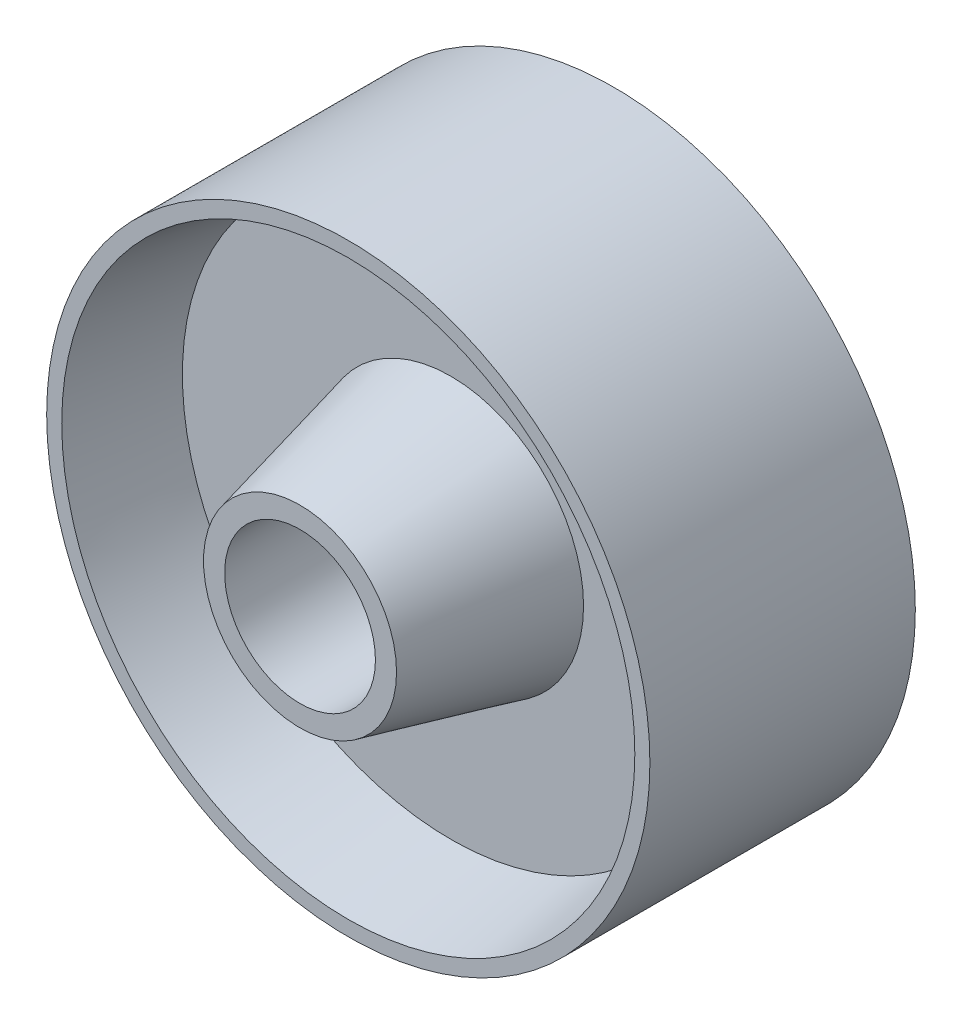
ISO-10303-21;
HEADER;
FILE_DESCRIPTION(('STEP AP214'),'2;1');
FILE_NAME('part.step','',(''),(''),'','','');
FILE_SCHEMA(('AUTOMOTIVE_DESIGN { 1 0 10303 214 1 1 1 1 }'));
ENDSEC;
DATA;
#1=APPLICATION_CONTEXT('core data for automotive mechanical design processes');
#2=APPLICATION_PROTOCOL_DEFINITION('international standard','automotive_design',2000,#1);
#3=PRODUCT_CONTEXT('',#1,'mechanical');
#4=PRODUCT('Part','Part','',(#3));
#5=PRODUCT_RELATED_PRODUCT_CATEGORY('part','',(#4));
#6=PRODUCT_DEFINITION_FORMATION('','',#4);
#7=PRODUCT_DEFINITION_CONTEXT('part definition',#1,'design');
#8=PRODUCT_DEFINITION('design','',#6,#7);
#9=PRODUCT_DEFINITION_SHAPE('','',#8);
#10=(LENGTH_UNIT() NAMED_UNIT(*) SI_UNIT(.MILLI.,.METRE.));
#11=(NAMED_UNIT(*) PLANE_ANGLE_UNIT() SI_UNIT($,.RADIAN.));
#12=(NAMED_UNIT(*) SI_UNIT($,.STERADIAN.) SOLID_ANGLE_UNIT());
#13=UNCERTAINTY_MEASURE_WITH_UNIT(LENGTH_MEASURE(1.E-05),#10,'distance_accuracy_value','');
#14=(GEOMETRIC_REPRESENTATION_CONTEXT(3) GLOBAL_UNCERTAINTY_ASSIGNED_CONTEXT((#13)) GLOBAL_UNIT_ASSIGNED_CONTEXT((#10,
#11,#12)) REPRESENTATION_CONTEXT('',''));
#15=CARTESIAN_POINT('',(0.,0.,0.));
#16=DIRECTION('',(0.,0.,1.));
#17=DIRECTION('',(1.,0.,0.));
#18=AXIS2_PLACEMENT_3D('',#15,#16,#17);
#19=CARTESIAN_POINT('',(0.,3.5,30.));
#20=DIRECTION('',(0.,0.,-1.));
#21=DIRECTION('',(-1.,0.,0.));
#22=AXIS2_PLACEMENT_3D('',#19,#20,#21);
#23=PLANE('',#22);
#24=CARTESIAN_POINT('',(0.,-12.5,30.));
#25=DIRECTION('',(0.,0.,1.));
#26=DIRECTION('',(1.,0.,0.));
#27=AXIS2_PLACEMENT_3D('',#24,#25,#26);
#28=CIRCLE('',#27,12.5);
#29=CARTESIAN_POINT('',(12.5,-12.5,30.));
#30=VERTEX_POINT('',#29);
#31=EDGE_CURVE('E10',#30,#30,#28,.T.);
#32=ORIENTED_EDGE('',*,*,#31,.F.);
#33=EDGE_LOOP('',(#32));
#34=FACE_BOUND('',#33,.T.);
#35=CARTESIAN_POINT('',(0.,-12.5,30.));
#36=DIRECTION('',(0.,0.,1.));
#37=DIRECTION('',(1.,0.,0.));
#38=AXIS2_PLACEMENT_3D('',#35,#36,#37);
#39=CIRCLE('',#38,16.);
#40=CARTESIAN_POINT('',(16.,-12.5,30.));
#41=VERTEX_POINT('',#40);
#42=EDGE_CURVE('E76',#41,#41,#39,.T.);
#43=ORIENTED_EDGE('',*,*,#42,.T.);
#44=EDGE_LOOP('',(#43));
#45=FACE_BOUND('',#44,.T.);
#46=ADVANCED_FACE('F36',(#34,#45),#23,.F.);
#47=CARTESIAN_POINT('',(0.,-12.5,51.6645674105156));
#48=DIRECTION('',(0.,0.,1.));
#49=DIRECTION('',(1.,0.,0.));
#50=AXIS2_PLACEMENT_3D('',#47,#48,#49);
#51=CYLINDRICAL_SURFACE('',#50,12.5);
#52=CARTESIAN_POINT('',(0.,-12.5,-30.));
#53=DIRECTION('',(0.,0.,1.));
#54=DIRECTION('',(1.,0.,0.));
#55=AXIS2_PLACEMENT_3D('',#52,#53,#54);
#56=CIRCLE('',#55,12.5);
#57=CARTESIAN_POINT('',(12.5,-12.5,-30.));
#58=VERTEX_POINT('',#57);
#59=EDGE_CURVE('E42',#58,#58,#56,.T.);
#60=ORIENTED_EDGE('',*,*,#59,.F.);
#61=EDGE_LOOP('',(#60));
#62=FACE_BOUND('',#61,.T.);
#63=ORIENTED_EDGE('',*,*,#31,.T.);
#64=EDGE_LOOP('',(#63));
#65=FACE_BOUND('',#64,.T.);
#66=ADVANCED_FACE('F137',(#62,#65),#51,.F.);
#67=CARTESIAN_POINT('',(0.,0.,-30.));
#68=DIRECTION('',(0.,0.,1.));
#69=DIRECTION('',(1.,0.,0.));
#70=AXIS2_PLACEMENT_3D('',#67,#68,#69);
#71=PLANE('',#70);
#72=CARTESIAN_POINT('',(0.,-12.5,-30.));
#73=DIRECTION('',(0.,0.,1.));
#74=DIRECTION('',(1.,0.,0.));
#75=AXIS2_PLACEMENT_3D('',#72,#73,#74);
#76=CIRCLE('',#75,16.);
#77=CARTESIAN_POINT('',(16.,-12.5,-30.));
#78=VERTEX_POINT('',#77);
#79=EDGE_CURVE('E46',#78,#78,#76,.T.);
#80=ORIENTED_EDGE('',*,*,#79,.F.);
#81=EDGE_LOOP('',(#80));
#82=FACE_BOUND('',#81,.T.);
#83=ORIENTED_EDGE('',*,*,#59,.T.);
#84=EDGE_LOOP('',(#83));
#85=FACE_BOUND('',#84,.T.);
#86=ADVANCED_FACE('F132',(#82,#85),#71,.F.);
#87=CARTESIAN_POINT('',(0.,-12.5,-30.));
#88=DIRECTION('',(0.,0.,1.));
#89=DIRECTION('',(1.,0.,0.));
#90=AXIS2_PLACEMENT_3D('',#87,#88,#89);
#91=CONICAL_SURFACE('',#90,16.,0.235544980720863);
#92=CARTESIAN_POINT('',(0.,-12.5,-5.));
#93=DIRECTION('',(0.,0.,1.));
#94=DIRECTION('',(1.,0.,0.));
#95=AXIS2_PLACEMENT_3D('',#92,#93,#94);
#96=CIRCLE('',#95,22.);
#97=CARTESIAN_POINT('',(22.,-12.5,-5.));
#98=VERTEX_POINT('',#97);
#99=EDGE_CURVE('E50',#98,#98,#96,.T.);
#100=ORIENTED_EDGE('',*,*,#99,.F.);
#101=EDGE_LOOP('',(#100));
#102=FACE_BOUND('',#101,.T.);
#103=ORIENTED_EDGE('',*,*,#79,.T.);
#104=EDGE_LOOP('',(#103));
#105=FACE_BOUND('',#104,.T.);
#106=ADVANCED_FACE('F126',(#102,#105),#91,.T.);
#107=CARTESIAN_POINT('',(0.,9.5,-5.));
#108=DIRECTION('',(0.,0.,1.));
#109=DIRECTION('',(1.,0.,0.));
#110=AXIS2_PLACEMENT_3D('',#107,#108,#109);
#111=PLANE('',#110);
#112=CARTESIAN_POINT('',(0.,-12.5,-5.));
#113=DIRECTION('',(0.,0.,1.));
#114=DIRECTION('',(1.,0.,0.));
#115=AXIS2_PLACEMENT_3D('',#112,#113,#114);
#116=CIRCLE('',#115,44.5);
#117=CARTESIAN_POINT('',(44.5,-12.5,-5.));
#118=VERTEX_POINT('',#117);
#119=EDGE_CURVE('E55',#118,#118,#116,.T.);
#120=ORIENTED_EDGE('',*,*,#119,.F.);
#121=EDGE_LOOP('',(#120));
#122=FACE_BOUND('',#121,.T.);
#123=ORIENTED_EDGE('',*,*,#99,.T.);
#124=EDGE_LOOP('',(#123));
#125=FACE_BOUND('',#124,.T.);
#126=ADVANCED_FACE('F120',(#122,#125),#111,.F.);
#127=CARTESIAN_POINT('',(0.,-12.5,-5.));
#128=DIRECTION('',(0.,0.,-1.));
#129=DIRECTION('',(-1.,0.,0.));
#130=AXIS2_PLACEMENT_3D('',#127,#128,#129);
#131=CONICAL_SURFACE('',#130,44.5,0.17467219900824);
#132=CARTESIAN_POINT('',(0.,-12.5,-22.));
#133=DIRECTION('',(0.,0.,1.));
#134=DIRECTION('',(1.,0.,0.));
#135=AXIS2_PLACEMENT_3D('',#132,#133,#134);
#136=CIRCLE('',#135,47.5);
#137=CARTESIAN_POINT('',(47.5,-12.5,-22.));
#138=VERTEX_POINT('',#137);
#139=EDGE_CURVE('E58',#138,#138,#136,.T.);
#140=ORIENTED_EDGE('',*,*,#139,.F.);
#141=EDGE_LOOP('',(#140));
#142=FACE_BOUND('',#141,.T.);
#143=ORIENTED_EDGE('',*,*,#119,.T.);
#144=EDGE_LOOP('',(#143));
#145=FACE_BOUND('',#144,.T.);
#146=ADVANCED_FACE('F114',(#142,#145),#131,.F.);
#147=CARTESIAN_POINT('',(0.,35.,-22.));
#148=DIRECTION('',(0.,0.,1.));
#149=DIRECTION('',(1.,0.,0.));
#150=AXIS2_PLACEMENT_3D('',#147,#148,#149);
#151=PLANE('',#150);
#152=CARTESIAN_POINT('',(0.,-12.5,-22.));
#153=DIRECTION('',(0.,0.,1.));
#154=DIRECTION('',(1.,0.,0.));
#155=AXIS2_PLACEMENT_3D('',#152,#153,#154);
#156=CIRCLE('',#155,50.);
#157=CARTESIAN_POINT('',(50.,-12.5,-22.));
#158=VERTEX_POINT('',#157);
#159=EDGE_CURVE('E61',#158,#158,#156,.T.);
#160=ORIENTED_EDGE('',*,*,#159,.F.);
#161=EDGE_LOOP('',(#160));
#162=FACE_BOUND('',#161,.T.);
#163=ORIENTED_EDGE('',*,*,#139,.T.);
#164=EDGE_LOOP('',(#163));
#165=FACE_BOUND('',#164,.T.);
#166=ADVANCED_FACE('F108',(#162,#165),#151,.F.);
#167=CARTESIAN_POINT('',(0.,-12.5,51.6645674105156));
#168=DIRECTION('',(0.,0.,1.));
#169=DIRECTION('',(1.,0.,0.));
#170=AXIS2_PLACEMENT_3D('',#167,#168,#169);
#171=CYLINDRICAL_SURFACE('',#170,50.);
#172=CARTESIAN_POINT('',(0.,-12.5,22.));
#173=DIRECTION('',(0.,0.,1.));
#174=DIRECTION('',(1.,0.,0.));
#175=AXIS2_PLACEMENT_3D('',#172,#173,#174);
#176=CIRCLE('',#175,50.);
#177=CARTESIAN_POINT('',(50.,-12.5,22.));
#178=VERTEX_POINT('',#177);
#179=EDGE_CURVE('E64',#178,#178,#176,.T.);
#180=ORIENTED_EDGE('',*,*,#179,.F.);
#181=EDGE_LOOP('',(#180));
#182=FACE_BOUND('',#181,.T.);
#183=ORIENTED_EDGE('',*,*,#159,.T.);
#184=EDGE_LOOP('',(#183));
#185=FACE_BOUND('',#184,.T.);
#186=ADVANCED_FACE('F102',(#182,#185),#171,.T.);
#187=CARTESIAN_POINT('',(0.,37.5,22.));
#188=DIRECTION('',(0.,0.,-1.));
#189=DIRECTION('',(-1.,0.,0.));
#190=AXIS2_PLACEMENT_3D('',#187,#188,#189);
#191=PLANE('',#190);
#192=CARTESIAN_POINT('',(0.,-12.5,22.));
#193=DIRECTION('',(0.,0.,1.));
#194=DIRECTION('',(1.,0.,0.));
#195=AXIS2_PLACEMENT_3D('',#192,#193,#194);
#196=CIRCLE('',#195,47.5);
#197=CARTESIAN_POINT('',(47.5,-12.5,22.));
#198=VERTEX_POINT('',#197);
#199=EDGE_CURVE('E67',#198,#198,#196,.T.);
#200=ORIENTED_EDGE('',*,*,#199,.F.);
#201=EDGE_LOOP('',(#200));
#202=FACE_BOUND('',#201,.T.);
#203=ORIENTED_EDGE('',*,*,#179,.T.);
#204=EDGE_LOOP('',(#203));
#205=FACE_BOUND('',#204,.T.);
#206=ADVANCED_FACE('F96',(#202,#205),#191,.F.);
#207=CARTESIAN_POINT('',(0.,-12.5,22.));
#208=DIRECTION('',(0.,0.,1.));
#209=DIRECTION('',(1.,0.,0.));
#210=AXIS2_PLACEMENT_3D('',#207,#208,#209);
#211=CONICAL_SURFACE('',#210,47.5,0.17467219900824);
#212=CARTESIAN_POINT('',(0.,-12.5,5.));
#213=DIRECTION('',(0.,0.,1.));
#214=DIRECTION('',(1.,0.,0.));
#215=AXIS2_PLACEMENT_3D('',#212,#213,#214);
#216=CIRCLE('',#215,44.5);
#217=CARTESIAN_POINT('',(44.5,-12.5,5.));
#218=VERTEX_POINT('',#217);
#219=EDGE_CURVE('E70',#218,#218,#216,.T.);
#220=ORIENTED_EDGE('',*,*,#219,.F.);
#221=EDGE_LOOP('',(#220));
#222=FACE_BOUND('',#221,.T.);
#223=ORIENTED_EDGE('',*,*,#199,.T.);
#224=EDGE_LOOP('',(#223));
#225=FACE_BOUND('',#224,.T.);
#226=ADVANCED_FACE('F90',(#222,#225),#211,.F.);
#227=CARTESIAN_POINT('',(0.,32.,5.));
#228=DIRECTION('',(0.,0.,-1.));
#229=DIRECTION('',(-1.,0.,0.));
#230=AXIS2_PLACEMENT_3D('',#227,#228,#229);
#231=PLANE('',#230);
#232=CARTESIAN_POINT('',(0.,-12.5,5.));
#233=DIRECTION('',(0.,0.,1.));
#234=DIRECTION('',(1.,0.,0.));
#235=AXIS2_PLACEMENT_3D('',#232,#233,#234);
#236=CIRCLE('',#235,22.);
#237=CARTESIAN_POINT('',(22.,-12.5,5.));
#238=VERTEX_POINT('',#237);
#239=EDGE_CURVE('E73',#238,#238,#236,.T.);
#240=ORIENTED_EDGE('',*,*,#239,.F.);
#241=EDGE_LOOP('',(#240));
#242=FACE_BOUND('',#241,.T.);
#243=ORIENTED_EDGE('',*,*,#219,.T.);
#244=EDGE_LOOP('',(#243));
#245=FACE_BOUND('',#244,.T.);
#246=ADVANCED_FACE('F84',(#242,#245),#231,.F.);
#247=CARTESIAN_POINT('',(0.,-12.5,5.));
#248=DIRECTION('',(0.,0.,-1.));
#249=DIRECTION('',(-1.,0.,0.));
#250=AXIS2_PLACEMENT_3D('',#247,#248,#249);
#251=CONICAL_SURFACE('',#250,22.,0.235544980720863);
#252=ORIENTED_EDGE('',*,*,#42,.F.);
#253=EDGE_LOOP('',(#252));
#254=FACE_BOUND('',#253,.T.);
#255=ORIENTED_EDGE('',*,*,#239,.T.);
#256=EDGE_LOOP('',(#255));
#257=FACE_BOUND('',#256,.T.);
#258=ADVANCED_FACE('F81',(#254,#257),#251,.T.);
#259=CLOSED_SHELL('',(#46,#66,#86,#106,#126,#146,#166,#186,#206,#226,#246,#258));
#260=MANIFOLD_SOLID_BREP('B2',#259);
#261=ADVANCED_BREP_SHAPE_REPRESENTATION('',(#18,#260),#14);
#262=SHAPE_DEFINITION_REPRESENTATION(#9,#261);
ENDSEC;
END-ISO-10303-21;
